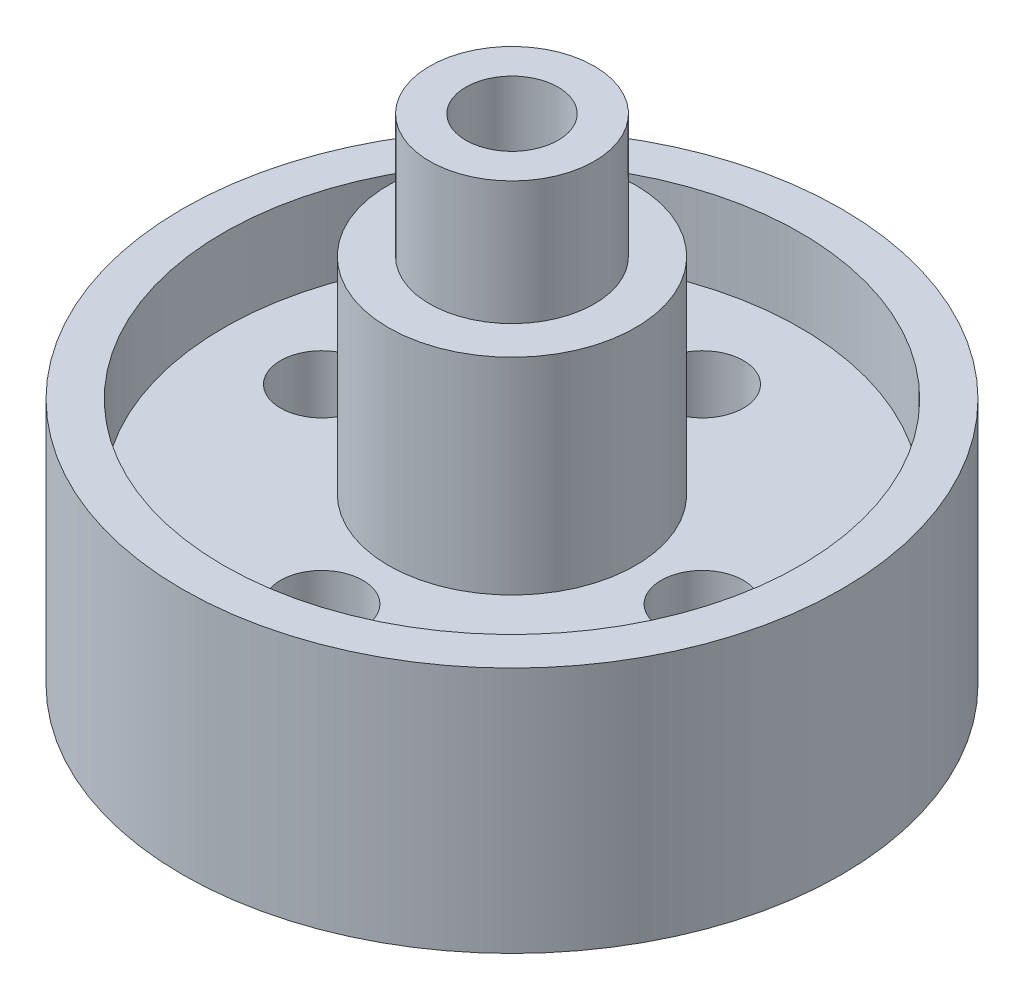
ISO-10303-21;
HEADER;
FILE_DESCRIPTION(('STEP AP214'),'2;1');
FILE_NAME('part.step','',(''),(''),'','','');
FILE_SCHEMA(('AUTOMOTIVE_DESIGN { 1 0 10303 214 1 1 1 1 }'));
ENDSEC;
DATA;
#1=APPLICATION_CONTEXT('core data for automotive mechanical design processes');
#2=APPLICATION_PROTOCOL_DEFINITION('international standard','automotive_design',2000,#1);
#3=PRODUCT_CONTEXT('',#1,'mechanical');
#4=PRODUCT('Part','Part','',(#3));
#5=PRODUCT_RELATED_PRODUCT_CATEGORY('part','',(#4));
#6=PRODUCT_DEFINITION_FORMATION('','',#4);
#7=PRODUCT_DEFINITION_CONTEXT('part definition',#1,'design');
#8=PRODUCT_DEFINITION('design','',#6,#7);
#9=PRODUCT_DEFINITION_SHAPE('','',#8);
#10=(LENGTH_UNIT() NAMED_UNIT(*) SI_UNIT(.MILLI.,.METRE.));
#11=(NAMED_UNIT(*) PLANE_ANGLE_UNIT() SI_UNIT($,.RADIAN.));
#12=(NAMED_UNIT(*) SI_UNIT($,.STERADIAN.) SOLID_ANGLE_UNIT());
#13=UNCERTAINTY_MEASURE_WITH_UNIT(LENGTH_MEASURE(1.E-05),#10,'distance_accuracy_value','');
#14=(GEOMETRIC_REPRESENTATION_CONTEXT(3) GLOBAL_UNCERTAINTY_ASSIGNED_CONTEXT((#13)) GLOBAL_UNIT_ASSIGNED_CONTEXT((#10,
#11,#12)) REPRESENTATION_CONTEXT('',''));
#15=CARTESIAN_POINT('',(0.,0.,0.));
#16=DIRECTION('',(0.,0.,1.));
#17=DIRECTION('',(1.,0.,0.));
#18=AXIS2_PLACEMENT_3D('',#15,#16,#17);
#19=CARTESIAN_POINT('',(0.,38.1,0.));
#20=DIRECTION('',(0.,-1.,0.));
#21=DIRECTION('',(0.,0.,-1.));
#22=AXIS2_PLACEMENT_3D('',#19,#20,#21);
#23=CYLINDRICAL_SURFACE('',#22,50.8);
#24=CARTESIAN_POINT('',(0.,38.1,0.));
#25=DIRECTION('',(0.,1.,0.));
#26=DIRECTION('',(0.,0.,1.));
#27=AXIS2_PLACEMENT_3D('',#24,#25,#26);
#28=CIRCLE('',#27,50.8);
#29=CARTESIAN_POINT('',(0.,38.1,-50.8));
#30=VERTEX_POINT('',#29);
#31=EDGE_CURVE('E51',#30,#30,#28,.T.);
#32=CARTESIAN_POINT('',(0.,0.,0.));
#33=DIRECTION('',(0.,1.,0.));
#34=DIRECTION('',(0.,0.,1.));
#35=AXIS2_PLACEMENT_3D('',#32,#33,#34);
#36=CIRCLE('',#35,50.8);
#37=CARTESIAN_POINT('',(0.,0.,-50.8));
#38=VERTEX_POINT('',#37);
#39=EDGE_CURVE('E46',#38,#38,#36,.T.);
#40=CARTESIAN_POINT('',(0.,38.1,-50.8));
#41=CARTESIAN_POINT('',(0.,37.703125,-50.8));
#42=CARTESIAN_POINT('',(0.,37.30625,-50.8));
#43=CARTESIAN_POINT('',(0.,36.5125,-50.8));
#44=CARTESIAN_POINT('',(0.,36.115625,-50.8));
#45=CARTESIAN_POINT('',(0.,35.321875,-50.8));
#46=CARTESIAN_POINT('',(0.,34.925,-50.8));
#47=CARTESIAN_POINT('',(0.,34.13125,-50.8));
#48=CARTESIAN_POINT('',(0.,33.734375,-50.8));
#49=CARTESIAN_POINT('',(0.,32.940625,-50.8));
#50=CARTESIAN_POINT('',(0.,32.54375,-50.8));
#51=CARTESIAN_POINT('',(0.,31.75,-50.8));
#52=CARTESIAN_POINT('',(0.,31.353125,-50.8));
#53=CARTESIAN_POINT('',(0.,30.559375,-50.8));
#54=CARTESIAN_POINT('',(0.,30.1625,-50.8));
#55=CARTESIAN_POINT('',(0.,29.36875,-50.8));
#56=CARTESIAN_POINT('',(0.,28.971875,-50.8));
#57=CARTESIAN_POINT('',(0.,28.178125,-50.8));
#58=CARTESIAN_POINT('',(0.,27.78125,-50.8));
#59=CARTESIAN_POINT('',(0.,26.9875,-50.8));
#60=CARTESIAN_POINT('',(0.,26.590625,-50.8));
#61=CARTESIAN_POINT('',(0.,25.796875,-50.8));
#62=CARTESIAN_POINT('',(0.,25.4,-50.8));
#63=CARTESIAN_POINT('',(0.,24.60625,-50.8));
#64=CARTESIAN_POINT('',(0.,24.209375,-50.8));
#65=CARTESIAN_POINT('',(0.,23.415625,-50.8));
#66=CARTESIAN_POINT('',(0.,23.01875,-50.8));
#67=CARTESIAN_POINT('',(0.,22.225,-50.8));
#68=CARTESIAN_POINT('',(0.,21.828125,-50.8));
#69=CARTESIAN_POINT('',(0.,21.034375,-50.8));
#70=CARTESIAN_POINT('',(0.,20.6375,-50.8));
#71=CARTESIAN_POINT('',(0.,19.84375,-50.8));
#72=CARTESIAN_POINT('',(0.,19.446875,-50.8));
#73=CARTESIAN_POINT('',(0.,18.653125,-50.8));
#74=CARTESIAN_POINT('',(0.,18.25625,-50.8));
#75=CARTESIAN_POINT('',(0.,17.4625,-50.8));
#76=CARTESIAN_POINT('',(0.,17.065625,-50.8));
#77=CARTESIAN_POINT('',(0.,16.271875,-50.8));
#78=CARTESIAN_POINT('',(0.,15.875,-50.8));
#79=CARTESIAN_POINT('',(0.,15.08125,-50.8));
#80=CARTESIAN_POINT('',(0.,14.684375,-50.8));
#81=CARTESIAN_POINT('',(0.,13.890625,-50.8));
#82=CARTESIAN_POINT('',(0.,13.49375,-50.8));
#83=CARTESIAN_POINT('',(0.,12.7,-50.8));
#84=CARTESIAN_POINT('',(0.,12.303125,-50.8));
#85=CARTESIAN_POINT('',(0.,11.509375,-50.8));
#86=CARTESIAN_POINT('',(0.,11.1125,-50.8));
#87=CARTESIAN_POINT('',(0.,10.31875,-50.8));
#88=CARTESIAN_POINT('',(0.,9.92187499999999,-50.8));
#89=CARTESIAN_POINT('',(0.,9.128125,-50.8));
#90=CARTESIAN_POINT('',(0.,8.73124999999999,-50.8));
#91=CARTESIAN_POINT('',(0.,7.93749999999999,-50.8));
#92=CARTESIAN_POINT('',(0.,7.54062499999999,-50.8));
#93=CARTESIAN_POINT('',(0.,6.746875,-50.8));
#94=CARTESIAN_POINT('',(0.,6.35,-50.8));
#95=CARTESIAN_POINT('',(0.,5.55625,-50.8));
#96=CARTESIAN_POINT('',(0.,5.159375,-50.8));
#97=CARTESIAN_POINT('',(0.,4.365625,-50.8));
#98=CARTESIAN_POINT('',(0.,3.96875,-50.8));
#99=CARTESIAN_POINT('',(0.,3.175,-50.8));
#100=CARTESIAN_POINT('',(0.,2.778125,-50.8));
#101=CARTESIAN_POINT('',(0.,1.984375,-50.8));
#102=CARTESIAN_POINT('',(0.,1.5875,-50.8));
#103=CARTESIAN_POINT('',(0.,0.79375,-50.8));
#104=CARTESIAN_POINT('',(0.,0.396875,-50.8));
#105=CARTESIAN_POINT('',(0.,0.,-50.8));
#106=B_SPLINE_CURVE_WITH_KNOTS('',3,(#40,#41,#42,#43,#44,#45,#46,#47,#48,#49,#50,#51,#52,#53,
#54,#55,#56,#57,#58,#59,#60,#61,#62,#63,#64,#65,#66,#67,#68,#69,#70,#71,#72,#73,#74,#75,#76,#77,
#78,#79,#80,#81,#82,#83,#84,#85,#86,#87,#88,#89,#90,#91,#92,#93,#94,#95,#96,#97,#98,#99,#100,
#101,#102,#103,#104,#105),.UNSPECIFIED.,.F.,.F.,(4,2,2,2,2,2,2,2,2,2,2,2,2,2,2,2,2,2,2,2,2,2,2,
2,2,2,2,2,2,2,2,2,4),(0.,1.190625,2.38125,3.571875,4.7625,5.953125,7.14375,8.334375,
9.52500000000001,10.715625,11.90625,13.096875,14.2875,15.478125,16.66875,17.859375,19.05,
20.240625,21.43125,22.621875,23.8125,25.003125,26.19375,27.384375,28.575,29.765625,30.95625,
32.146875,33.3375,34.528125,35.71875,36.909375,38.1),.UNSPECIFIED.);
#107=EDGE_CURVE('BSEAM43',#30,#38,#106,.T.);
#108=ORIENTED_EDGE('',*,*,#31,.F.);
#109=ORIENTED_EDGE('',*,*,#39,.T.);
#110=ORIENTED_EDGE('',*,*,#107,.T.);
#111=ORIENTED_EDGE('',*,*,#107,.F.);
#112=EDGE_LOOP('',(#108,#110,#109,#111));
#113=FACE_BOUND('',#112,.T.);
#114=ADVANCED_FACE('F43',(#113),#23,.T.);
#115=CARTESIAN_POINT('',(0.,38.1,0.));
#116=DIRECTION('',(0.,1.,0.));
#117=DIRECTION('',(0.,0.,1.));
#118=AXIS2_PLACEMENT_3D('',#115,#116,#117);
#119=PLANE('',#118);
#120=CARTESIAN_POINT('',(0.,38.1,0.));
#121=DIRECTION('',(0.,1.,0.));
#122=DIRECTION('',(0.,0.,1.));
#123=AXIS2_PLACEMENT_3D('',#120,#121,#122);
#124=CIRCLE('',#123,44.45);
#125=CARTESIAN_POINT('',(0.,38.1,44.45));
#126=VERTEX_POINT('',#125);
#127=EDGE_CURVE('E65',#126,#126,#124,.T.);
#128=ORIENTED_EDGE('',*,*,#127,.F.);
#129=EDGE_LOOP('',(#128));
#130=FACE_BOUND('',#129,.T.);
#131=ORIENTED_EDGE('',*,*,#31,.T.);
#132=EDGE_LOOP('',(#131));
#133=FACE_BOUND('',#132,.T.);
#134=ADVANCED_FACE('F80',(#130,#133),#119,.T.);
#135=CARTESIAN_POINT('',(0.,0.,0.));
#136=DIRECTION('',(0.,1.,0.));
#137=DIRECTION('',(0.,0.,1.));
#138=AXIS2_PLACEMENT_3D('',#135,#136,#137);
#139=PLANE('',#138);
#140=CARTESIAN_POINT('',(0.,0.,29.337));
#141=DIRECTION('',(0.,1.,0.));
#142=DIRECTION('',(0.,0.,1.));
#143=AXIS2_PLACEMENT_3D('',#140,#141,#142);
#144=CIRCLE('',#143,6.35);
#145=CARTESIAN_POINT('',(0.,0.,35.687));
#146=VERTEX_POINT('',#145);
#147=EDGE_CURVE('E146',#146,#146,#144,.T.);
#148=ORIENTED_EDGE('',*,*,#147,.T.);
#149=EDGE_LOOP('',(#148));
#150=FACE_BOUND('',#149,.T.);
#151=CARTESIAN_POINT('',(-29.337,0.,-1.02429588037641E-13));
#152=DIRECTION('',(0.,1.,0.));
#153=DIRECTION('',(0.,0.,1.));
#154=AXIS2_PLACEMENT_3D('',#151,#152,#153);
#155=CIRCLE('',#154,6.35);
#156=CARTESIAN_POINT('',(-29.337,0.,6.3499999999999));
#157=VERTEX_POINT('',#156);
#158=EDGE_CURVE('E158',#157,#157,#155,.T.);
#159=ORIENTED_EDGE('',*,*,#158,.T.);
#160=EDGE_LOOP('',(#159));
#161=FACE_BOUND('',#160,.T.);
#162=CARTESIAN_POINT('',(2.04859176075282E-13,0.,-29.337));
#163=DIRECTION('',(0.,1.,0.));
#164=DIRECTION('',(0.,0.,1.));
#165=AXIS2_PLACEMENT_3D('',#162,#163,#164);
#166=CIRCLE('',#165,6.35);
#167=CARTESIAN_POINT('',(2.04859176075282E-13,0.,-22.987));
#168=VERTEX_POINT('',#167);
#169=EDGE_CURVE('E168',#168,#168,#166,.T.);
#170=ORIENTED_EDGE('',*,*,#169,.T.);
#171=EDGE_LOOP('',(#170));
#172=FACE_BOUND('',#171,.T.);
#173=CARTESIAN_POINT('',(29.337,0.,3.07288764112923E-13));
#174=DIRECTION('',(0.,1.,0.));
#175=DIRECTION('',(0.,0.,1.));
#176=AXIS2_PLACEMENT_3D('',#173,#174,#175);
#177=CIRCLE('',#176,6.35);
#178=CARTESIAN_POINT('',(29.337,0.,6.35000000000031));
#179=VERTEX_POINT('',#178);
#180=EDGE_CURVE('E176',#179,#179,#177,.T.);
#181=ORIENTED_EDGE('',*,*,#180,.T.);
#182=EDGE_LOOP('',(#181));
#183=FACE_BOUND('',#182,.T.);
#184=CARTESIAN_POINT('',(0.,0.,0.));
#185=DIRECTION('',(0.,1.,0.));
#186=DIRECTION('',(0.,0.,1.));
#187=AXIS2_PLACEMENT_3D('',#184,#185,#186);
#188=CIRCLE('',#187,7.112);
#189=CARTESIAN_POINT('',(0.,0.,7.112));
#190=VERTEX_POINT('',#189);
#191=EDGE_CURVE('E180',#190,#190,#188,.T.);
#192=ORIENTED_EDGE('',*,*,#191,.T.);
#193=EDGE_LOOP('',(#192));
#194=FACE_BOUND('',#193,.T.);
#195=ORIENTED_EDGE('',*,*,#39,.F.);
#196=EDGE_LOOP('',(#195));
#197=FACE_BOUND('',#196,.T.);
#198=ADVANCED_FACE('F83',(#150,#161,#172,#183,#194,#197),#139,.F.);
#199=CARTESIAN_POINT('',(0.,25.4,0.));
#200=DIRECTION('',(0.,1.,0.));
#201=DIRECTION('',(0.,0.,1.));
#202=AXIS2_PLACEMENT_3D('',#199,#200,#201);
#203=CYLINDRICAL_SURFACE('',#202,44.45);
#204=CARTESIAN_POINT('',(0.,25.4,0.));
#205=DIRECTION('',(0.,1.,0.));
#206=DIRECTION('',(0.,0.,1.));
#207=AXIS2_PLACEMENT_3D('',#204,#205,#206);
#208=CIRCLE('',#207,44.45);
#209=CARTESIAN_POINT('',(0.,25.4,44.45));
#210=VERTEX_POINT('',#209);
#211=EDGE_CURVE('E70',#210,#210,#208,.T.);
#212=ORIENTED_EDGE('',*,*,#211,.F.);
#213=EDGE_LOOP('',(#212));
#214=FACE_BOUND('',#213,.T.);
#215=ORIENTED_EDGE('',*,*,#127,.T.);
#216=EDGE_LOOP('',(#215));
#217=FACE_BOUND('',#216,.T.);
#218=ADVANCED_FACE('F78',(#214,#217),#203,.F.);
#219=CARTESIAN_POINT('',(0.,25.4,0.));
#220=DIRECTION('',(0.,1.,0.));
#221=DIRECTION('',(0.,0.,1.));
#222=AXIS2_PLACEMENT_3D('',#219,#220,#221);
#223=PLANE('',#222);
#224=CARTESIAN_POINT('',(0.,25.4,29.337));
#225=DIRECTION('',(0.,1.,0.));
#226=DIRECTION('',(0.,0.,1.));
#227=AXIS2_PLACEMENT_3D('',#224,#225,#226);
#228=CIRCLE('',#227,6.35);
#229=CARTESIAN_POINT('',(0.,25.4,35.687));
#230=VERTEX_POINT('',#229);
#231=EDGE_CURVE('E149',#230,#230,#228,.T.);
#232=ORIENTED_EDGE('',*,*,#231,.F.);
#233=EDGE_LOOP('',(#232));
#234=FACE_BOUND('',#233,.T.);
#235=CARTESIAN_POINT('',(-29.337,25.4,-1.02429588037641E-13));
#236=DIRECTION('',(0.,1.,0.));
#237=DIRECTION('',(0.,0.,1.));
#238=AXIS2_PLACEMENT_3D('',#235,#236,#237);
#239=CIRCLE('',#238,6.35);
#240=CARTESIAN_POINT('',(-29.337,25.4,6.3499999999999));
#241=VERTEX_POINT('',#240);
#242=EDGE_CURVE('E151',#241,#241,#239,.T.);
#243=ORIENTED_EDGE('',*,*,#242,.F.);
#244=EDGE_LOOP('',(#243));
#245=FACE_BOUND('',#244,.T.);
#246=CARTESIAN_POINT('',(2.04859176075282E-13,25.4,-29.337));
#247=DIRECTION('',(0.,1.,0.));
#248=DIRECTION('',(0.,0.,1.));
#249=AXIS2_PLACEMENT_3D('',#246,#247,#248);
#250=CIRCLE('',#249,6.35);
#251=CARTESIAN_POINT('',(2.04859176075282E-13,25.4,-22.987));
#252=VERTEX_POINT('',#251);
#253=EDGE_CURVE('E164',#252,#252,#250,.T.);
#254=ORIENTED_EDGE('',*,*,#253,.F.);
#255=EDGE_LOOP('',(#254));
#256=FACE_BOUND('',#255,.T.);
#257=CARTESIAN_POINT('',(29.337,25.4,3.07288764112923E-13));
#258=DIRECTION('',(0.,1.,0.));
#259=DIRECTION('',(0.,0.,1.));
#260=AXIS2_PLACEMENT_3D('',#257,#258,#259);
#261=CIRCLE('',#260,6.35);
#262=CARTESIAN_POINT('',(29.337,25.4,6.35000000000031));
#263=VERTEX_POINT('',#262);
#264=EDGE_CURVE('E172',#263,#263,#261,.T.);
#265=ORIENTED_EDGE('',*,*,#264,.F.);
#266=EDGE_LOOP('',(#265));
#267=FACE_BOUND('',#266,.T.);
#268=CARTESIAN_POINT('',(0.,25.4,0.));
#269=DIRECTION('',(0.,1.,0.));
#270=DIRECTION('',(0.,0.,1.));
#271=AXIS2_PLACEMENT_3D('',#268,#269,#270);
#272=CIRCLE('',#271,19.05);
#273=CARTESIAN_POINT('',(0.,25.4,19.05));
#274=VERTEX_POINT('',#273);
#275=EDGE_CURVE('E66',#274,#274,#272,.T.);
#276=ORIENTED_EDGE('',*,*,#275,.F.);
#277=EDGE_LOOP('',(#276));
#278=FACE_BOUND('',#277,.T.);
#279=ORIENTED_EDGE('',*,*,#211,.T.);
#280=EDGE_LOOP('',(#279));
#281=FACE_BOUND('',#280,.T.);
#282=ADVANCED_FACE('F100',(#234,#245,#256,#267,#278,#281),#223,.T.);
#283=CARTESIAN_POINT('',(0.,57.15,0.));
#284=DIRECTION('',(0.,-1.,0.));
#285=DIRECTION('',(0.,0.,-1.));
#286=AXIS2_PLACEMENT_3D('',#283,#284,#285);
#287=CYLINDRICAL_SURFACE('',#286,19.05);
#288=CARTESIAN_POINT('',(0.,57.15,0.));
#289=DIRECTION('',(0.,1.,0.));
#290=DIRECTION('',(0.,0.,1.));
#291=AXIS2_PLACEMENT_3D('',#288,#289,#290);
#292=CIRCLE('',#291,19.05);
#293=CARTESIAN_POINT('',(0.,57.15,19.05));
#294=VERTEX_POINT('',#293);
#295=EDGE_CURVE('E61',#294,#294,#292,.T.);
#296=ORIENTED_EDGE('',*,*,#295,.F.);
#297=EDGE_LOOP('',(#296));
#298=FACE_BOUND('',#297,.T.);
#299=ORIENTED_EDGE('',*,*,#275,.T.);
#300=EDGE_LOOP('',(#299));
#301=FACE_BOUND('',#300,.T.);
#302=ADVANCED_FACE('F107',(#298,#301),#287,.T.);
#303=CARTESIAN_POINT('',(0.,57.15,0.));
#304=DIRECTION('',(0.,1.,0.));
#305=DIRECTION('',(0.,0.,1.));
#306=AXIS2_PLACEMENT_3D('',#303,#304,#305);
#307=PLANE('',#306);
#308=CARTESIAN_POINT('',(0.,57.15,0.));
#309=DIRECTION('',(0.,1.,0.));
#310=DIRECTION('',(0.,0.,1.));
#311=AXIS2_PLACEMENT_3D('',#308,#309,#310);
#312=CIRCLE('',#311,12.7);
#313=CARTESIAN_POINT('',(0.,57.15,-12.7));
#314=VERTEX_POINT('',#313);
#315=EDGE_CURVE('E10',#314,#314,#312,.T.);
#316=ORIENTED_EDGE('',*,*,#315,.F.);
#317=EDGE_LOOP('',(#316));
#318=FACE_BOUND('',#317,.T.);
#319=ORIENTED_EDGE('',*,*,#295,.T.);
#320=EDGE_LOOP('',(#319));
#321=FACE_BOUND('',#320,.T.);
#322=ADVANCED_FACE('F111',(#318,#321),#307,.T.);
#323=CARTESIAN_POINT('',(0.,76.2,0.));
#324=DIRECTION('',(0.,-1.,0.));
#325=DIRECTION('',(0.,0.,-1.));
#326=AXIS2_PLACEMENT_3D('',#323,#324,#325);
#327=CYLINDRICAL_SURFACE('',#326,12.7);
#328=CARTESIAN_POINT('',(0.,76.2,0.));
#329=DIRECTION('',(0.,1.,0.));
#330=DIRECTION('',(0.,0.,1.));
#331=AXIS2_PLACEMENT_3D('',#328,#329,#330);
#332=CIRCLE('',#331,12.7);
#333=CARTESIAN_POINT('',(0.,76.2,-12.7));
#334=VERTEX_POINT('',#333);
#335=EDGE_CURVE('E59',#334,#334,#332,.T.);
#336=CARTESIAN_POINT('',(0.,76.2,-12.7));
#337=CARTESIAN_POINT('',(0.,76.0015625,-12.7));
#338=CARTESIAN_POINT('',(0.,75.803125,-12.7));
#339=CARTESIAN_POINT('',(0.,75.40625,-12.7));
#340=CARTESIAN_POINT('',(0.,75.2078125,-12.7));
#341=CARTESIAN_POINT('',(0.,74.8109375,-12.7));
#342=CARTESIAN_POINT('',(0.,74.6125,-12.7));
#343=CARTESIAN_POINT('',(0.,74.215625,-12.7));
#344=CARTESIAN_POINT('',(0.,74.0171875,-12.7));
#345=CARTESIAN_POINT('',(0.,73.6203125,-12.7));
#346=CARTESIAN_POINT('',(0.,73.421875,-12.7));
#347=CARTESIAN_POINT('',(0.,73.025,-12.7));
#348=CARTESIAN_POINT('',(0.,72.8265625,-12.7));
#349=CARTESIAN_POINT('',(0.,72.4296875,-12.7));
#350=CARTESIAN_POINT('',(0.,72.23125,-12.7));
#351=CARTESIAN_POINT('',(0.,71.834375,-12.7));
#352=CARTESIAN_POINT('',(0.,71.6359375,-12.7));
#353=CARTESIAN_POINT('',(0.,71.2390625,-12.7));
#354=CARTESIAN_POINT('',(0.,71.040625,-12.7));
#355=CARTESIAN_POINT('',(0.,70.64375,-12.7));
#356=CARTESIAN_POINT('',(0.,70.4453125,-12.7));
#357=CARTESIAN_POINT('',(0.,70.0484375,-12.7));
#358=CARTESIAN_POINT('',(0.,69.85,-12.7));
#359=CARTESIAN_POINT('',(0.,69.453125,-12.7));
#360=CARTESIAN_POINT('',(0.,69.2546875,-12.7));
#361=CARTESIAN_POINT('',(0.,68.8578125,-12.7));
#362=CARTESIAN_POINT('',(0.,68.659375,-12.7));
#363=CARTESIAN_POINT('',(0.,68.2625,-12.7));
#364=CARTESIAN_POINT('',(0.,68.0640625,-12.7));
#365=CARTESIAN_POINT('',(0.,67.6671875,-12.7));
#366=CARTESIAN_POINT('',(0.,67.46875,-12.7));
#367=CARTESIAN_POINT('',(0.,67.071875,-12.7));
#368=CARTESIAN_POINT('',(0.,66.8734375,-12.7));
#369=CARTESIAN_POINT('',(0.,66.4765625,-12.7));
#370=CARTESIAN_POINT('',(0.,66.278125,-12.7));
#371=CARTESIAN_POINT('',(0.,65.88125,-12.7));
#372=CARTESIAN_POINT('',(0.,65.6828125,-12.7));
#373=CARTESIAN_POINT('',(0.,65.2859375,-12.7));
#374=CARTESIAN_POINT('',(0.,65.0875,-12.7));
#375=CARTESIAN_POINT('',(0.,64.690625,-12.7));
#376=CARTESIAN_POINT('',(0.,64.4921875,-12.7));
#377=CARTESIAN_POINT('',(0.,64.0953125,-12.7));
#378=CARTESIAN_POINT('',(0.,63.896875,-12.7));
#379=CARTESIAN_POINT('',(0.,63.5,-12.7));
#380=CARTESIAN_POINT('',(0.,63.3015625,-12.7));
#381=CARTESIAN_POINT('',(0.,62.9046875,-12.7));
#382=CARTESIAN_POINT('',(0.,62.70625,-12.7));
#383=CARTESIAN_POINT('',(0.,62.309375,-12.7));
#384=CARTESIAN_POINT('',(0.,62.1109375,-12.7));
#385=CARTESIAN_POINT('',(0.,61.7140625,-12.7));
#386=CARTESIAN_POINT('',(0.,61.515625,-12.7));
#387=CARTESIAN_POINT('',(0.,61.11875,-12.7));
#388=CARTESIAN_POINT('',(0.,60.9203125,-12.7));
#389=CARTESIAN_POINT('',(0.,60.5234375,-12.7));
#390=CARTESIAN_POINT('',(0.,60.325,-12.7));
#391=CARTESIAN_POINT('',(0.,59.928125,-12.7));
#392=CARTESIAN_POINT('',(0.,59.7296875,-12.7));
#393=CARTESIAN_POINT('',(0.,59.3328125,-12.7));
#394=CARTESIAN_POINT('',(0.,59.134375,-12.7));
#395=CARTESIAN_POINT('',(0.,58.7375,-12.7));
#396=CARTESIAN_POINT('',(0.,58.5390625,-12.7));
#397=CARTESIAN_POINT('',(0.,58.1421875,-12.7));
#398=CARTESIAN_POINT('',(0.,57.94375,-12.7));
#399=CARTESIAN_POINT('',(0.,57.546875,-12.7));
#400=CARTESIAN_POINT('',(0.,57.3484375,-12.7));
#401=CARTESIAN_POINT('',(0.,57.15,-12.7));
#402=B_SPLINE_CURVE_WITH_KNOTS('',3,(#336,#337,#338,#339,#340,#341,#342,#343,#344,#345,#346,
#347,#348,#349,#350,#351,#352,#353,#354,#355,#356,#357,#358,#359,#360,#361,#362,#363,#364,#365,
#366,#367,#368,#369,#370,#371,#372,#373,#374,#375,#376,#377,#378,#379,#380,#381,#382,#383,#384,
#385,#386,#387,#388,#389,#390,#391,#392,#393,#394,#395,#396,#397,#398,#399,#400,#401),
.UNSPECIFIED.,.F.,.F.,(4,2,2,2,2,2,2,2,2,2,2,2,2,2,2,2,2,2,2,2,2,2,2,2,2,2,2,2,2,2,2,2,4),(0.,
0.5953125,1.190625,1.7859375,2.38125,2.9765625,3.571875,4.1671875,4.7625,5.3578125,5.953125,
6.5484375,7.14375,7.7390625,8.334375,8.92968750000001,9.52500000000001,10.1203125,10.715625,
11.3109375,11.90625,12.5015625,13.096875,13.6921875,14.2875,14.8828125,15.478125,16.0734375,
16.66875,17.2640625,17.859375,18.4546875,19.05),.UNSPECIFIED.);
#403=EDGE_CURVE('BSEAM115',#334,#314,#402,.T.);
#404=ORIENTED_EDGE('',*,*,#335,.F.);
#405=ORIENTED_EDGE('',*,*,#315,.T.);
#406=ORIENTED_EDGE('',*,*,#403,.T.);
#407=ORIENTED_EDGE('',*,*,#403,.F.);
#408=EDGE_LOOP('',(#404,#406,#405,#407));
#409=FACE_BOUND('',#408,.T.);
#410=ADVANCED_FACE('F115',(#409),#327,.T.);
#411=CARTESIAN_POINT('',(0.,76.2,0.));
#412=DIRECTION('',(0.,1.,0.));
#413=DIRECTION('',(0.,0.,1.));
#414=AXIS2_PLACEMENT_3D('',#411,#412,#413);
#415=PLANE('',#414);
#416=CARTESIAN_POINT('',(0.,76.2,0.));
#417=DIRECTION('',(0.,1.,0.));
#418=DIRECTION('',(0.,0.,1.));
#419=AXIS2_PLACEMENT_3D('',#416,#417,#418);
#420=CIRCLE('',#419,7.112);
#421=CARTESIAN_POINT('',(0.,76.2,7.112));
#422=VERTEX_POINT('',#421);
#423=EDGE_CURVE('E155',#422,#422,#420,.T.);
#424=ORIENTED_EDGE('',*,*,#423,.F.);
#425=EDGE_LOOP('',(#424));
#426=FACE_BOUND('',#425,.T.);
#427=ORIENTED_EDGE('',*,*,#335,.T.);
#428=EDGE_LOOP('',(#427));
#429=FACE_BOUND('',#428,.T.);
#430=ADVANCED_FACE('F119',(#426,#429),#415,.T.);
#431=CARTESIAN_POINT('',(0.,0.,0.));
#432=DIRECTION('',(0.,1.,0.));
#433=DIRECTION('',(0.,0.,1.));
#434=AXIS2_PLACEMENT_3D('',#431,#432,#433);
#435=CYLINDRICAL_SURFACE('',#434,7.112);
#436=CARTESIAN_POINT('',(0.,0.,7.112));
#437=CARTESIAN_POINT('',(0.,0.79375,7.112));
#438=CARTESIAN_POINT('',(0.,1.5875,7.112));
#439=CARTESIAN_POINT('',(0.,3.175,7.112));
#440=CARTESIAN_POINT('',(0.,3.96875,7.112));
#441=CARTESIAN_POINT('',(0.,5.55625,7.112));
#442=CARTESIAN_POINT('',(0.,6.35,7.112));
#443=CARTESIAN_POINT('',(0.,7.9375,7.112));
#444=CARTESIAN_POINT('',(0.,8.73125,7.112));
#445=CARTESIAN_POINT('',(0.,10.31875,7.112));
#446=CARTESIAN_POINT('',(0.,11.1125,7.112));
#447=CARTESIAN_POINT('',(0.,12.7,7.112));
#448=CARTESIAN_POINT('',(0.,13.49375,7.112));
#449=CARTESIAN_POINT('',(0.,15.08125,7.112));
#450=CARTESIAN_POINT('',(0.,15.875,7.112));
#451=CARTESIAN_POINT('',(0.,17.4625,7.112));
#452=CARTESIAN_POINT('',(0.,18.25625,7.112));
#453=CARTESIAN_POINT('',(0.,19.84375,7.112));
#454=CARTESIAN_POINT('',(0.,20.6375,7.112));
#455=CARTESIAN_POINT('',(0.,22.225,7.112));
#456=CARTESIAN_POINT('',(0.,23.01875,7.112));
#457=CARTESIAN_POINT('',(0.,24.60625,7.112));
#458=CARTESIAN_POINT('',(0.,25.4,7.112));
#459=CARTESIAN_POINT('',(0.,26.9875,7.112));
#460=CARTESIAN_POINT('',(0.,27.78125,7.112));
#461=CARTESIAN_POINT('',(0.,29.36875,7.112));
#462=CARTESIAN_POINT('',(0.,30.1625,7.112));
#463=CARTESIAN_POINT('',(0.,31.75,7.112));
#464=CARTESIAN_POINT('',(0.,32.54375,7.112));
#465=CARTESIAN_POINT('',(0.,34.13125,7.112));
#466=CARTESIAN_POINT('',(0.,34.925,7.112));
#467=CARTESIAN_POINT('',(0.,36.5125,7.112));
#468=CARTESIAN_POINT('',(0.,37.30625,7.112));
#469=CARTESIAN_POINT('',(0.,38.89375,7.112));
#470=CARTESIAN_POINT('',(0.,39.6875,7.112));
#471=CARTESIAN_POINT('',(0.,41.275,7.112));
#472=CARTESIAN_POINT('',(0.,42.06875,7.112));
#473=CARTESIAN_POINT('',(0.,43.65625,7.112));
#474=CARTESIAN_POINT('',(0.,44.45,7.112));
#475=CARTESIAN_POINT('',(0.,46.0375,7.112));
#476=CARTESIAN_POINT('',(0.,46.83125,7.112));
#477=CARTESIAN_POINT('',(0.,48.41875,7.112));
#478=CARTESIAN_POINT('',(0.,49.2125,7.112));
#479=CARTESIAN_POINT('',(0.,50.8,7.112));
#480=CARTESIAN_POINT('',(0.,51.59375,7.112));
#481=CARTESIAN_POINT('',(0.,53.18125,7.112));
#482=CARTESIAN_POINT('',(0.,53.975,7.112));
#483=CARTESIAN_POINT('',(0.,55.5625,7.112));
#484=CARTESIAN_POINT('',(0.,56.35625,7.112));
#485=CARTESIAN_POINT('',(0.,57.94375,7.112));
#486=CARTESIAN_POINT('',(0.,58.7375,7.112));
#487=CARTESIAN_POINT('',(0.,60.325,7.112));
#488=CARTESIAN_POINT('',(0.,61.11875,7.112));
#489=CARTESIAN_POINT('',(0.,62.70625,7.112));
#490=CARTESIAN_POINT('',(0.,63.5,7.112));
#491=CARTESIAN_POINT('',(0.,65.0875,7.112));
#492=CARTESIAN_POINT('',(0.,65.88125,7.112));
#493=CARTESIAN_POINT('',(0.,67.46875,7.112));
#494=CARTESIAN_POINT('',(0.,68.2625,7.112));
#495=CARTESIAN_POINT('',(0.,69.85,7.112));
#496=CARTESIAN_POINT('',(0.,70.64375,7.112));
#497=CARTESIAN_POINT('',(0.,72.23125,7.112));
#498=CARTESIAN_POINT('',(0.,73.025,7.112));
#499=CARTESIAN_POINT('',(0.,74.6125,7.112));
#500=CARTESIAN_POINT('',(0.,75.40625,7.112));
#501=CARTESIAN_POINT('',(0.,76.2,7.112));
#502=B_SPLINE_CURVE_WITH_KNOTS('',3,(#436,#437,#438,#439,#440,#441,#442,#443,#444,#445,#446,
#447,#448,#449,#450,#451,#452,#453,#454,#455,#456,#457,#458,#459,#460,#461,#462,#463,#464,#465,
#466,#467,#468,#469,#470,#471,#472,#473,#474,#475,#476,#477,#478,#479,#480,#481,#482,#483,#484,
#485,#486,#487,#488,#489,#490,#491,#492,#493,#494,#495,#496,#497,#498,#499,#500,#501),
.UNSPECIFIED.,.F.,.F.,(4,2,2,2,2,2,2,2,2,2,2,2,2,2,2,2,2,2,2,2,2,2,2,2,2,2,2,2,2,2,2,2,4),(0.,
2.38125,4.7625,7.14375,9.525,11.90625,14.2875,16.66875,19.05,21.43125,23.8125,26.19375,28.575,
30.95625,33.3375,35.71875,38.1,40.48125,42.8625,45.24375,47.625,50.00625,52.3875,54.76875,57.15,
59.53125,61.9125,64.29375,66.675,69.05625,71.4375,73.81875,76.2),.UNSPECIFIED.);
#503=EDGE_CURVE('BSEAM123',#190,#422,#502,.T.);
#504=ORIENTED_EDGE('',*,*,#191,.F.);
#505=ORIENTED_EDGE('',*,*,#423,.T.);
#506=ORIENTED_EDGE('',*,*,#503,.T.);
#507=ORIENTED_EDGE('',*,*,#503,.F.);
#508=EDGE_LOOP('',(#504,#506,#505,#507));
#509=FACE_BOUND('',#508,.T.);
#510=ADVANCED_FACE('F123',(#509),#435,.F.);
#511=CARTESIAN_POINT('',(29.337,0.,3.07288764112923E-13));
#512=DIRECTION('',(0.,1.,0.));
#513=DIRECTION('',(0.,0.,1.));
#514=AXIS2_PLACEMENT_3D('',#511,#512,#513);
#515=CYLINDRICAL_SURFACE('',#514,6.35);
#516=CARTESIAN_POINT('',(29.337,0.,6.35000000000031));
#517=CARTESIAN_POINT('',(29.337,0.264583333333333,6.35000000000031));
#518=CARTESIAN_POINT('',(29.337,0.529166666666667,6.35000000000031));
#519=CARTESIAN_POINT('',(29.337,1.05833333333333,6.35000000000031));
#520=CARTESIAN_POINT('',(29.337,1.32291666666667,6.35000000000031));
#521=CARTESIAN_POINT('',(29.337,1.85208333333333,6.35000000000031));
#522=CARTESIAN_POINT('',(29.337,2.11666666666667,6.35000000000031));
#523=CARTESIAN_POINT('',(29.337,2.64583333333333,6.35000000000031));
#524=CARTESIAN_POINT('',(29.337,2.91041666666667,6.35000000000031));
#525=CARTESIAN_POINT('',(29.337,3.43958333333333,6.35000000000031));
#526=CARTESIAN_POINT('',(29.337,3.70416666666667,6.35000000000031));
#527=CARTESIAN_POINT('',(29.337,4.23333333333333,6.35000000000031));
#528=CARTESIAN_POINT('',(29.337,4.49791666666667,6.35000000000031));
#529=CARTESIAN_POINT('',(29.337,5.02708333333333,6.35000000000031));
#530=CARTESIAN_POINT('',(29.337,5.29166666666667,6.35000000000031));
#531=CARTESIAN_POINT('',(29.337,5.82083333333333,6.35000000000031));
#532=CARTESIAN_POINT('',(29.337,6.08541666666667,6.35000000000031));
#533=CARTESIAN_POINT('',(29.337,6.61458333333333,6.35000000000031));
#534=CARTESIAN_POINT('',(29.337,6.87916666666667,6.35000000000031));
#535=CARTESIAN_POINT('',(29.337,7.40833333333333,6.35000000000031));
#536=CARTESIAN_POINT('',(29.337,7.67291666666667,6.35000000000031));
#537=CARTESIAN_POINT('',(29.337,8.20208333333333,6.35000000000031));
#538=CARTESIAN_POINT('',(29.337,8.46666666666667,6.35000000000031));
#539=CARTESIAN_POINT('',(29.337,8.99583333333334,6.35000000000031));
#540=CARTESIAN_POINT('',(29.337,9.26041666666667,6.35000000000031));
#541=CARTESIAN_POINT('',(29.337,9.78958333333333,6.35000000000031));
#542=CARTESIAN_POINT('',(29.337,10.0541666666667,6.35000000000031));
#543=CARTESIAN_POINT('',(29.337,10.5833333333333,6.35000000000031));
#544=CARTESIAN_POINT('',(29.337,10.8479166666667,6.35000000000031));
#545=CARTESIAN_POINT('',(29.337,11.3770833333333,6.35000000000031));
#546=CARTESIAN_POINT('',(29.337,11.6416666666667,6.35000000000031));
#547=CARTESIAN_POINT('',(29.337,12.1708333333333,6.35000000000031));
#548=CARTESIAN_POINT('',(29.337,12.4354166666667,6.35000000000031));
#549=CARTESIAN_POINT('',(29.337,12.9645833333333,6.35000000000031));
#550=CARTESIAN_POINT('',(29.337,13.2291666666667,6.35000000000031));
#551=CARTESIAN_POINT('',(29.337,13.7583333333333,6.35000000000031));
#552=CARTESIAN_POINT('',(29.337,14.0229166666667,6.35000000000031));
#553=CARTESIAN_POINT('',(29.337,14.5520833333333,6.35000000000031));
#554=CARTESIAN_POINT('',(29.337,14.8166666666667,6.35000000000031));
#555=CARTESIAN_POINT('',(29.337,15.3458333333333,6.35000000000031));
#556=CARTESIAN_POINT('',(29.337,15.6104166666667,6.35000000000031));
#557=CARTESIAN_POINT('',(29.337,16.1395833333333,6.35000000000031));
#558=CARTESIAN_POINT('',(29.337,16.4041666666667,6.35000000000031));
#559=CARTESIAN_POINT('',(29.337,16.9333333333333,6.35000000000031));
#560=CARTESIAN_POINT('',(29.337,17.1979166666667,6.35000000000031));
#561=CARTESIAN_POINT('',(29.337,17.7270833333333,6.35000000000031));
#562=CARTESIAN_POINT('',(29.337,17.9916666666667,6.35000000000031));
#563=CARTESIAN_POINT('',(29.337,18.5208333333333,6.35000000000031));
#564=CARTESIAN_POINT('',(29.337,18.7854166666667,6.35000000000031));
#565=CARTESIAN_POINT('',(29.337,19.3145833333333,6.35000000000031));
#566=CARTESIAN_POINT('',(29.337,19.5791666666667,6.35000000000031));
#567=CARTESIAN_POINT('',(29.337,20.1083333333333,6.35000000000031));
#568=CARTESIAN_POINT('',(29.337,20.3729166666667,6.35000000000031));
#569=CARTESIAN_POINT('',(29.337,20.9020833333333,6.35000000000031));
#570=CARTESIAN_POINT('',(29.337,21.1666666666667,6.35000000000031));
#571=CARTESIAN_POINT('',(29.337,21.6958333333333,6.35000000000031));
#572=CARTESIAN_POINT('',(29.337,21.9604166666667,6.35000000000031));
#573=CARTESIAN_POINT('',(29.337,22.4895833333333,6.35000000000031));
#574=CARTESIAN_POINT('',(29.337,22.7541666666667,6.35000000000031));
#575=CARTESIAN_POINT('',(29.337,23.2833333333333,6.35000000000031));
#576=CARTESIAN_POINT('',(29.337,23.5479166666667,6.35000000000031));
#577=CARTESIAN_POINT('',(29.337,24.0770833333333,6.35000000000031));
#578=CARTESIAN_POINT('',(29.337,24.3416666666667,6.35000000000031));
#579=CARTESIAN_POINT('',(29.337,24.8708333333333,6.35000000000031));
#580=CARTESIAN_POINT('',(29.337,25.1354166666667,6.35000000000031));
#581=CARTESIAN_POINT('',(29.337,25.4,6.35000000000031));
#582=B_SPLINE_CURVE_WITH_KNOTS('',3,(#516,#517,#518,#519,#520,#521,#522,#523,#524,#525,#526,
#527,#528,#529,#530,#531,#532,#533,#534,#535,#536,#537,#538,#539,#540,#541,#542,#543,#544,#545,
#546,#547,#548,#549,#550,#551,#552,#553,#554,#555,#556,#557,#558,#559,#560,#561,#562,#563,#564,
#565,#566,#567,#568,#569,#570,#571,#572,#573,#574,#575,#576,#577,#578,#579,#580,#581),
.UNSPECIFIED.,.F.,.F.,(4,2,2,2,2,2,2,2,2,2,2,2,2,2,2,2,2,2,2,2,2,2,2,2,2,2,2,2,2,2,2,2,4),(0.,
0.79375,1.5875,2.38125,3.175,3.96875,4.7625,5.55625,6.35,7.14375,7.9375,8.73125,9.525,10.31875,
11.1125,11.90625,12.7,13.49375,14.2875,15.08125,15.875,16.66875,17.4625,18.25625,19.05,19.84375,
20.6375,21.43125,22.225,23.01875,23.8125,24.60625,25.4),.UNSPECIFIED.);
#583=EDGE_CURVE('BSEAM126',#179,#263,#582,.T.);
#584=ORIENTED_EDGE('',*,*,#180,.F.);
#585=ORIENTED_EDGE('',*,*,#264,.T.);
#586=ORIENTED_EDGE('',*,*,#583,.T.);
#587=ORIENTED_EDGE('',*,*,#583,.F.);
#588=EDGE_LOOP('',(#584,#586,#585,#587));
#589=FACE_BOUND('',#588,.T.);
#590=ADVANCED_FACE('F126',(#589),#515,.F.);
#591=CARTESIAN_POINT('',(2.04859176075282E-13,0.,-29.337));
#592=DIRECTION('',(0.,1.,0.));
#593=DIRECTION('',(0.,0.,1.));
#594=AXIS2_PLACEMENT_3D('',#591,#592,#593);
#595=CYLINDRICAL_SURFACE('',#594,6.35);
#596=CARTESIAN_POINT('',(2.04859176075282E-13,0.,-22.987));
#597=CARTESIAN_POINT('',(2.04859176075282E-13,0.264583333333333,-22.987));
#598=CARTESIAN_POINT('',(2.04859176075282E-13,0.529166666666667,-22.987));
#599=CARTESIAN_POINT('',(2.04859176075282E-13,1.05833333333333,-22.987));
#600=CARTESIAN_POINT('',(2.04859176075282E-13,1.32291666666667,-22.987));
#601=CARTESIAN_POINT('',(2.04859176075282E-13,1.85208333333333,-22.987));
#602=CARTESIAN_POINT('',(2.04859176075282E-13,2.11666666666667,-22.987));
#603=CARTESIAN_POINT('',(2.04859176075282E-13,2.64583333333333,-22.987));
#604=CARTESIAN_POINT('',(2.04859176075282E-13,2.91041666666667,-22.987));
#605=CARTESIAN_POINT('',(2.04859176075282E-13,3.43958333333333,-22.987));
#606=CARTESIAN_POINT('',(2.04859176075282E-13,3.70416666666667,-22.987));
#607=CARTESIAN_POINT('',(2.04859176075282E-13,4.23333333333333,-22.987));
#608=CARTESIAN_POINT('',(2.04859176075282E-13,4.49791666666667,-22.987));
#609=CARTESIAN_POINT('',(2.04859176075282E-13,5.02708333333333,-22.987));
#610=CARTESIAN_POINT('',(2.04859176075282E-13,5.29166666666667,-22.987));
#611=CARTESIAN_POINT('',(2.04859176075282E-13,5.82083333333333,-22.987));
#612=CARTESIAN_POINT('',(2.04859176075282E-13,6.08541666666667,-22.987));
#613=CARTESIAN_POINT('',(2.04859176075282E-13,6.61458333333333,-22.987));
#614=CARTESIAN_POINT('',(2.04859176075282E-13,6.87916666666667,-22.987));
#615=CARTESIAN_POINT('',(2.04859176075282E-13,7.40833333333333,-22.987));
#616=CARTESIAN_POINT('',(2.04859176075282E-13,7.67291666666667,-22.987));
#617=CARTESIAN_POINT('',(2.04859176075282E-13,8.20208333333333,-22.987));
#618=CARTESIAN_POINT('',(2.04859176075282E-13,8.46666666666667,-22.987));
#619=CARTESIAN_POINT('',(2.04859176075282E-13,8.99583333333334,-22.987));
#620=CARTESIAN_POINT('',(2.04859176075282E-13,9.26041666666667,-22.987));
#621=CARTESIAN_POINT('',(2.04859176075282E-13,9.78958333333333,-22.987));
#622=CARTESIAN_POINT('',(2.04859176075282E-13,10.0541666666667,-22.987));
#623=CARTESIAN_POINT('',(2.04859176075282E-13,10.5833333333333,-22.987));
#624=CARTESIAN_POINT('',(2.04859176075282E-13,10.8479166666667,-22.987));
#625=CARTESIAN_POINT('',(2.04859176075282E-13,11.3770833333333,-22.987));
#626=CARTESIAN_POINT('',(2.04859176075282E-13,11.6416666666667,-22.987));
#627=CARTESIAN_POINT('',(2.04859176075282E-13,12.1708333333333,-22.987));
#628=CARTESIAN_POINT('',(2.04859176075282E-13,12.4354166666667,-22.987));
#629=CARTESIAN_POINT('',(2.04859176075282E-13,12.9645833333333,-22.987));
#630=CARTESIAN_POINT('',(2.04859176075282E-13,13.2291666666667,-22.987));
#631=CARTESIAN_POINT('',(2.04859176075282E-13,13.7583333333333,-22.987));
#632=CARTESIAN_POINT('',(2.04859176075282E-13,14.0229166666667,-22.987));
#633=CARTESIAN_POINT('',(2.04859176075282E-13,14.5520833333333,-22.987));
#634=CARTESIAN_POINT('',(2.04859176075282E-13,14.8166666666667,-22.987));
#635=CARTESIAN_POINT('',(2.04859176075282E-13,15.3458333333333,-22.987));
#636=CARTESIAN_POINT('',(2.04859176075282E-13,15.6104166666667,-22.987));
#637=CARTESIAN_POINT('',(2.04859176075282E-13,16.1395833333333,-22.987));
#638=CARTESIAN_POINT('',(2.04859176075282E-13,16.4041666666667,-22.987));
#639=CARTESIAN_POINT('',(2.04859176075282E-13,16.9333333333333,-22.987));
#640=CARTESIAN_POINT('',(2.04859176075282E-13,17.1979166666667,-22.987));
#641=CARTESIAN_POINT('',(2.04859176075282E-13,17.7270833333333,-22.987));
#642=CARTESIAN_POINT('',(2.04859176075282E-13,17.9916666666667,-22.987));
#643=CARTESIAN_POINT('',(2.04859176075282E-13,18.5208333333333,-22.987));
#644=CARTESIAN_POINT('',(2.04859176075282E-13,18.7854166666667,-22.987));
#645=CARTESIAN_POINT('',(2.04859176075282E-13,19.3145833333333,-22.987));
#646=CARTESIAN_POINT('',(2.04859176075282E-13,19.5791666666667,-22.987));
#647=CARTESIAN_POINT('',(2.04859176075282E-13,20.1083333333333,-22.987));
#648=CARTESIAN_POINT('',(2.04859176075282E-13,20.3729166666667,-22.987));
#649=CARTESIAN_POINT('',(2.04859176075282E-13,20.9020833333333,-22.987));
#650=CARTESIAN_POINT('',(2.04859176075282E-13,21.1666666666667,-22.987));
#651=CARTESIAN_POINT('',(2.04859176075282E-13,21.6958333333333,-22.987));
#652=CARTESIAN_POINT('',(2.04859176075282E-13,21.9604166666667,-22.987));
#653=CARTESIAN_POINT('',(2.04859176075282E-13,22.4895833333333,-22.987));
#654=CARTESIAN_POINT('',(2.04859176075282E-13,22.7541666666667,-22.987));
#655=CARTESIAN_POINT('',(2.04859176075282E-13,23.2833333333333,-22.987));
#656=CARTESIAN_POINT('',(2.04859176075282E-13,23.5479166666667,-22.987));
#657=CARTESIAN_POINT('',(2.04859176075282E-13,24.0770833333333,-22.987));
#658=CARTESIAN_POINT('',(2.04859176075282E-13,24.3416666666667,-22.987));
#659=CARTESIAN_POINT('',(2.04859176075282E-13,24.8708333333333,-22.987));
#660=CARTESIAN_POINT('',(2.04859176075282E-13,25.1354166666667,-22.987));
#661=CARTESIAN_POINT('',(2.04859176075282E-13,25.4,-22.987));
#662=B_SPLINE_CURVE_WITH_KNOTS('',3,(#596,#597,#598,#599,#600,#601,#602,#603,#604,#605,#606,
#607,#608,#609,#610,#611,#612,#613,#614,#615,#616,#617,#618,#619,#620,#621,#622,#623,#624,#625,
#626,#627,#628,#629,#630,#631,#632,#633,#634,#635,#636,#637,#638,#639,#640,#641,#642,#643,#644,
#645,#646,#647,#648,#649,#650,#651,#652,#653,#654,#655,#656,#657,#658,#659,#660,#661),
.UNSPECIFIED.,.F.,.F.,(4,2,2,2,2,2,2,2,2,2,2,2,2,2,2,2,2,2,2,2,2,2,2,2,2,2,2,2,2,2,2,2,4),(0.,
0.79375,1.5875,2.38125,3.175,3.96875,4.7625,5.55625,6.35,7.14375,7.9375,8.73125,9.525,10.31875,
11.1125,11.90625,12.7,13.49375,14.2875,15.08125,15.875,16.66875,17.4625,18.25625,19.05,19.84375,
20.6375,21.43125,22.225,23.01875,23.8125,24.60625,25.4),.UNSPECIFIED.);
#663=EDGE_CURVE('BSEAM130',#168,#252,#662,.T.);
#664=ORIENTED_EDGE('',*,*,#169,.F.);
#665=ORIENTED_EDGE('',*,*,#253,.T.);
#666=ORIENTED_EDGE('',*,*,#663,.T.);
#667=ORIENTED_EDGE('',*,*,#663,.F.);
#668=EDGE_LOOP('',(#664,#666,#665,#667));
#669=FACE_BOUND('',#668,.T.);
#670=ADVANCED_FACE('F130',(#669),#595,.F.);
#671=CARTESIAN_POINT('',(-29.337,0.,-1.02429588037641E-13));
#672=DIRECTION('',(0.,1.,0.));
#673=DIRECTION('',(0.,0.,1.));
#674=AXIS2_PLACEMENT_3D('',#671,#672,#673);
#675=CYLINDRICAL_SURFACE('',#674,6.35);
#676=CARTESIAN_POINT('',(-29.337,0.,6.3499999999999));
#677=CARTESIAN_POINT('',(-29.337,0.264583333333333,6.3499999999999));
#678=CARTESIAN_POINT('',(-29.337,0.529166666666667,6.3499999999999));
#679=CARTESIAN_POINT('',(-29.337,1.05833333333333,6.3499999999999));
#680=CARTESIAN_POINT('',(-29.337,1.32291666666667,6.3499999999999));
#681=CARTESIAN_POINT('',(-29.337,1.85208333333333,6.3499999999999));
#682=CARTESIAN_POINT('',(-29.337,2.11666666666667,6.3499999999999));
#683=CARTESIAN_POINT('',(-29.337,2.64583333333333,6.3499999999999));
#684=CARTESIAN_POINT('',(-29.337,2.91041666666667,6.3499999999999));
#685=CARTESIAN_POINT('',(-29.337,3.43958333333333,6.3499999999999));
#686=CARTESIAN_POINT('',(-29.337,3.70416666666667,6.3499999999999));
#687=CARTESIAN_POINT('',(-29.337,4.23333333333333,6.3499999999999));
#688=CARTESIAN_POINT('',(-29.337,4.49791666666667,6.3499999999999));
#689=CARTESIAN_POINT('',(-29.337,5.02708333333333,6.3499999999999));
#690=CARTESIAN_POINT('',(-29.337,5.29166666666667,6.3499999999999));
#691=CARTESIAN_POINT('',(-29.337,5.82083333333333,6.3499999999999));
#692=CARTESIAN_POINT('',(-29.337,6.08541666666667,6.3499999999999));
#693=CARTESIAN_POINT('',(-29.337,6.61458333333333,6.3499999999999));
#694=CARTESIAN_POINT('',(-29.337,6.87916666666667,6.3499999999999));
#695=CARTESIAN_POINT('',(-29.337,7.40833333333333,6.3499999999999));
#696=CARTESIAN_POINT('',(-29.337,7.67291666666667,6.3499999999999));
#697=CARTESIAN_POINT('',(-29.337,8.20208333333333,6.3499999999999));
#698=CARTESIAN_POINT('',(-29.337,8.46666666666667,6.3499999999999));
#699=CARTESIAN_POINT('',(-29.337,8.99583333333334,6.3499999999999));
#700=CARTESIAN_POINT('',(-29.337,9.26041666666667,6.3499999999999));
#701=CARTESIAN_POINT('',(-29.337,9.78958333333333,6.3499999999999));
#702=CARTESIAN_POINT('',(-29.337,10.0541666666667,6.3499999999999));
#703=CARTESIAN_POINT('',(-29.337,10.5833333333333,6.3499999999999));
#704=CARTESIAN_POINT('',(-29.337,10.8479166666667,6.3499999999999));
#705=CARTESIAN_POINT('',(-29.337,11.3770833333333,6.3499999999999));
#706=CARTESIAN_POINT('',(-29.337,11.6416666666667,6.3499999999999));
#707=CARTESIAN_POINT('',(-29.337,12.1708333333333,6.3499999999999));
#708=CARTESIAN_POINT('',(-29.337,12.4354166666667,6.3499999999999));
#709=CARTESIAN_POINT('',(-29.337,12.9645833333333,6.3499999999999));
#710=CARTESIAN_POINT('',(-29.337,13.2291666666667,6.3499999999999));
#711=CARTESIAN_POINT('',(-29.337,13.7583333333333,6.3499999999999));
#712=CARTESIAN_POINT('',(-29.337,14.0229166666667,6.3499999999999));
#713=CARTESIAN_POINT('',(-29.337,14.5520833333333,6.3499999999999));
#714=CARTESIAN_POINT('',(-29.337,14.8166666666667,6.3499999999999));
#715=CARTESIAN_POINT('',(-29.337,15.3458333333333,6.3499999999999));
#716=CARTESIAN_POINT('',(-29.337,15.6104166666667,6.3499999999999));
#717=CARTESIAN_POINT('',(-29.337,16.1395833333333,6.3499999999999));
#718=CARTESIAN_POINT('',(-29.337,16.4041666666667,6.3499999999999));
#719=CARTESIAN_POINT('',(-29.337,16.9333333333333,6.3499999999999));
#720=CARTESIAN_POINT('',(-29.337,17.1979166666667,6.3499999999999));
#721=CARTESIAN_POINT('',(-29.337,17.7270833333333,6.3499999999999));
#722=CARTESIAN_POINT('',(-29.337,17.9916666666667,6.3499999999999));
#723=CARTESIAN_POINT('',(-29.337,18.5208333333333,6.3499999999999));
#724=CARTESIAN_POINT('',(-29.337,18.7854166666667,6.3499999999999));
#725=CARTESIAN_POINT('',(-29.337,19.3145833333333,6.3499999999999));
#726=CARTESIAN_POINT('',(-29.337,19.5791666666667,6.3499999999999));
#727=CARTESIAN_POINT('',(-29.337,20.1083333333333,6.3499999999999));
#728=CARTESIAN_POINT('',(-29.337,20.3729166666667,6.3499999999999));
#729=CARTESIAN_POINT('',(-29.337,20.9020833333333,6.3499999999999));
#730=CARTESIAN_POINT('',(-29.337,21.1666666666667,6.3499999999999));
#731=CARTESIAN_POINT('',(-29.337,21.6958333333333,6.3499999999999));
#732=CARTESIAN_POINT('',(-29.337,21.9604166666667,6.3499999999999));
#733=CARTESIAN_POINT('',(-29.337,22.4895833333333,6.3499999999999));
#734=CARTESIAN_POINT('',(-29.337,22.7541666666667,6.3499999999999));
#735=CARTESIAN_POINT('',(-29.337,23.2833333333333,6.3499999999999));
#736=CARTESIAN_POINT('',(-29.337,23.5479166666667,6.3499999999999));
#737=CARTESIAN_POINT('',(-29.337,24.0770833333333,6.3499999999999));
#738=CARTESIAN_POINT('',(-29.337,24.3416666666667,6.3499999999999));
#739=CARTESIAN_POINT('',(-29.337,24.8708333333333,6.3499999999999));
#740=CARTESIAN_POINT('',(-29.337,25.1354166666667,6.3499999999999));
#741=CARTESIAN_POINT('',(-29.337,25.4,6.3499999999999));
#742=B_SPLINE_CURVE_WITH_KNOTS('',3,(#676,#677,#678,#679,#680,#681,#682,#683,#684,#685,#686,
#687,#688,#689,#690,#691,#692,#693,#694,#695,#696,#697,#698,#699,#700,#701,#702,#703,#704,#705,
#706,#707,#708,#709,#710,#711,#712,#713,#714,#715,#716,#717,#718,#719,#720,#721,#722,#723,#724,
#725,#726,#727,#728,#729,#730,#731,#732,#733,#734,#735,#736,#737,#738,#739,#740,#741),
.UNSPECIFIED.,.F.,.F.,(4,2,2,2,2,2,2,2,2,2,2,2,2,2,2,2,2,2,2,2,2,2,2,2,2,2,2,2,2,2,2,2,4),(0.,
0.79375,1.5875,2.38125,3.175,3.96875,4.7625,5.55625,6.35,7.14375,7.9375,8.73125,9.525,10.31875,
11.1125,11.90625,12.7,13.49375,14.2875,15.08125,15.875,16.66875,17.4625,18.25625,19.05,19.84375,
20.6375,21.43125,22.225,23.01875,23.8125,24.60625,25.4),.UNSPECIFIED.);
#743=EDGE_CURVE('BSEAM134',#157,#241,#742,.T.);
#744=ORIENTED_EDGE('',*,*,#158,.F.);
#745=ORIENTED_EDGE('',*,*,#242,.T.);
#746=ORIENTED_EDGE('',*,*,#743,.T.);
#747=ORIENTED_EDGE('',*,*,#743,.F.);
#748=EDGE_LOOP('',(#744,#746,#745,#747));
#749=FACE_BOUND('',#748,.T.);
#750=ADVANCED_FACE('F134',(#749),#675,.F.);
#751=CARTESIAN_POINT('',(0.,0.,29.337));
#752=DIRECTION('',(0.,1.,0.));
#753=DIRECTION('',(0.,0.,1.));
#754=AXIS2_PLACEMENT_3D('',#751,#752,#753);
#755=CYLINDRICAL_SURFACE('',#754,6.35);
#756=CARTESIAN_POINT('',(0.,0.,35.687));
#757=CARTESIAN_POINT('',(0.,0.264583333333333,35.687));
#758=CARTESIAN_POINT('',(0.,0.529166666666667,35.687));
#759=CARTESIAN_POINT('',(0.,1.05833333333333,35.687));
#760=CARTESIAN_POINT('',(0.,1.32291666666667,35.687));
#761=CARTESIAN_POINT('',(0.,1.85208333333333,35.687));
#762=CARTESIAN_POINT('',(0.,2.11666666666667,35.687));
#763=CARTESIAN_POINT('',(0.,2.64583333333333,35.687));
#764=CARTESIAN_POINT('',(0.,2.91041666666667,35.687));
#765=CARTESIAN_POINT('',(0.,3.43958333333333,35.687));
#766=CARTESIAN_POINT('',(0.,3.70416666666667,35.687));
#767=CARTESIAN_POINT('',(0.,4.23333333333333,35.687));
#768=CARTESIAN_POINT('',(0.,4.49791666666667,35.687));
#769=CARTESIAN_POINT('',(0.,5.02708333333333,35.687));
#770=CARTESIAN_POINT('',(0.,5.29166666666667,35.687));
#771=CARTESIAN_POINT('',(0.,5.82083333333333,35.687));
#772=CARTESIAN_POINT('',(0.,6.08541666666667,35.687));
#773=CARTESIAN_POINT('',(0.,6.61458333333333,35.687));
#774=CARTESIAN_POINT('',(0.,6.87916666666667,35.687));
#775=CARTESIAN_POINT('',(0.,7.40833333333333,35.687));
#776=CARTESIAN_POINT('',(0.,7.67291666666667,35.687));
#777=CARTESIAN_POINT('',(0.,8.20208333333333,35.687));
#778=CARTESIAN_POINT('',(0.,8.46666666666667,35.687));
#779=CARTESIAN_POINT('',(0.,8.99583333333334,35.687));
#780=CARTESIAN_POINT('',(0.,9.26041666666667,35.687));
#781=CARTESIAN_POINT('',(0.,9.78958333333333,35.687));
#782=CARTESIAN_POINT('',(0.,10.0541666666667,35.687));
#783=CARTESIAN_POINT('',(0.,10.5833333333333,35.687));
#784=CARTESIAN_POINT('',(0.,10.8479166666667,35.687));
#785=CARTESIAN_POINT('',(0.,11.3770833333333,35.687));
#786=CARTESIAN_POINT('',(0.,11.6416666666667,35.687));
#787=CARTESIAN_POINT('',(0.,12.1708333333333,35.687));
#788=CARTESIAN_POINT('',(0.,12.4354166666667,35.687));
#789=CARTESIAN_POINT('',(0.,12.9645833333333,35.687));
#790=CARTESIAN_POINT('',(0.,13.2291666666667,35.687));
#791=CARTESIAN_POINT('',(0.,13.7583333333333,35.687));
#792=CARTESIAN_POINT('',(0.,14.0229166666667,35.687));
#793=CARTESIAN_POINT('',(0.,14.5520833333333,35.687));
#794=CARTESIAN_POINT('',(0.,14.8166666666667,35.687));
#795=CARTESIAN_POINT('',(0.,15.3458333333333,35.687));
#796=CARTESIAN_POINT('',(0.,15.6104166666667,35.687));
#797=CARTESIAN_POINT('',(0.,16.1395833333333,35.687));
#798=CARTESIAN_POINT('',(0.,16.4041666666667,35.687));
#799=CARTESIAN_POINT('',(0.,16.9333333333333,35.687));
#800=CARTESIAN_POINT('',(0.,17.1979166666667,35.687));
#801=CARTESIAN_POINT('',(0.,17.7270833333333,35.687));
#802=CARTESIAN_POINT('',(0.,17.9916666666667,35.687));
#803=CARTESIAN_POINT('',(0.,18.5208333333333,35.687));
#804=CARTESIAN_POINT('',(0.,18.7854166666667,35.687));
#805=CARTESIAN_POINT('',(0.,19.3145833333333,35.687));
#806=CARTESIAN_POINT('',(0.,19.5791666666667,35.687));
#807=CARTESIAN_POINT('',(0.,20.1083333333333,35.687));
#808=CARTESIAN_POINT('',(0.,20.3729166666667,35.687));
#809=CARTESIAN_POINT('',(0.,20.9020833333333,35.687));
#810=CARTESIAN_POINT('',(0.,21.1666666666667,35.687));
#811=CARTESIAN_POINT('',(0.,21.6958333333333,35.687));
#812=CARTESIAN_POINT('',(0.,21.9604166666667,35.687));
#813=CARTESIAN_POINT('',(0.,22.4895833333333,35.687));
#814=CARTESIAN_POINT('',(0.,22.7541666666667,35.687));
#815=CARTESIAN_POINT('',(0.,23.2833333333333,35.687));
#816=CARTESIAN_POINT('',(0.,23.5479166666667,35.687));
#817=CARTESIAN_POINT('',(0.,24.0770833333333,35.687));
#818=CARTESIAN_POINT('',(0.,24.3416666666667,35.687));
#819=CARTESIAN_POINT('',(0.,24.8708333333333,35.687));
#820=CARTESIAN_POINT('',(0.,25.1354166666667,35.687));
#821=CARTESIAN_POINT('',(0.,25.4,35.687));
#822=B_SPLINE_CURVE_WITH_KNOTS('',3,(#756,#757,#758,#759,#760,#761,#762,#763,#764,#765,#766,
#767,#768,#769,#770,#771,#772,#773,#774,#775,#776,#777,#778,#779,#780,#781,#782,#783,#784,#785,
#786,#787,#788,#789,#790,#791,#792,#793,#794,#795,#796,#797,#798,#799,#800,#801,#802,#803,#804,
#805,#806,#807,#808,#809,#810,#811,#812,#813,#814,#815,#816,#817,#818,#819,#820,#821),
.UNSPECIFIED.,.F.,.F.,(4,2,2,2,2,2,2,2,2,2,2,2,2,2,2,2,2,2,2,2,2,2,2,2,2,2,2,2,2,2,2,2,4),(0.,
0.79375,1.5875,2.38125,3.175,3.96875,4.7625,5.55625,6.35,7.14375,7.9375,8.73125,9.525,10.31875,
11.1125,11.90625,12.7,13.49375,14.2875,15.08125,15.875,16.66875,17.4625,18.25625,19.05,19.84375,
20.6375,21.43125,22.225,23.01875,23.8125,24.60625,25.4),.UNSPECIFIED.);
#823=EDGE_CURVE('BSEAM138',#146,#230,#822,.T.);
#824=ORIENTED_EDGE('',*,*,#147,.F.);
#825=ORIENTED_EDGE('',*,*,#231,.T.);
#826=ORIENTED_EDGE('',*,*,#823,.T.);
#827=ORIENTED_EDGE('',*,*,#823,.F.);
#828=EDGE_LOOP('',(#824,#826,#825,#827));
#829=FACE_BOUND('',#828,.T.);
#830=ADVANCED_FACE('F138',(#829),#755,.F.);
#831=CLOSED_SHELL('',(#114,#134,#198,#218,#282,#302,#322,#410,#430,#510,#590,#670,#750,#830));
#832=MANIFOLD_SOLID_BREP('B2',#831);
#833=ADVANCED_BREP_SHAPE_REPRESENTATION('',(#18,#832),#14);
#834=SHAPE_DEFINITION_REPRESENTATION(#9,#833);
ENDSEC;
END-ISO-10303-21;
